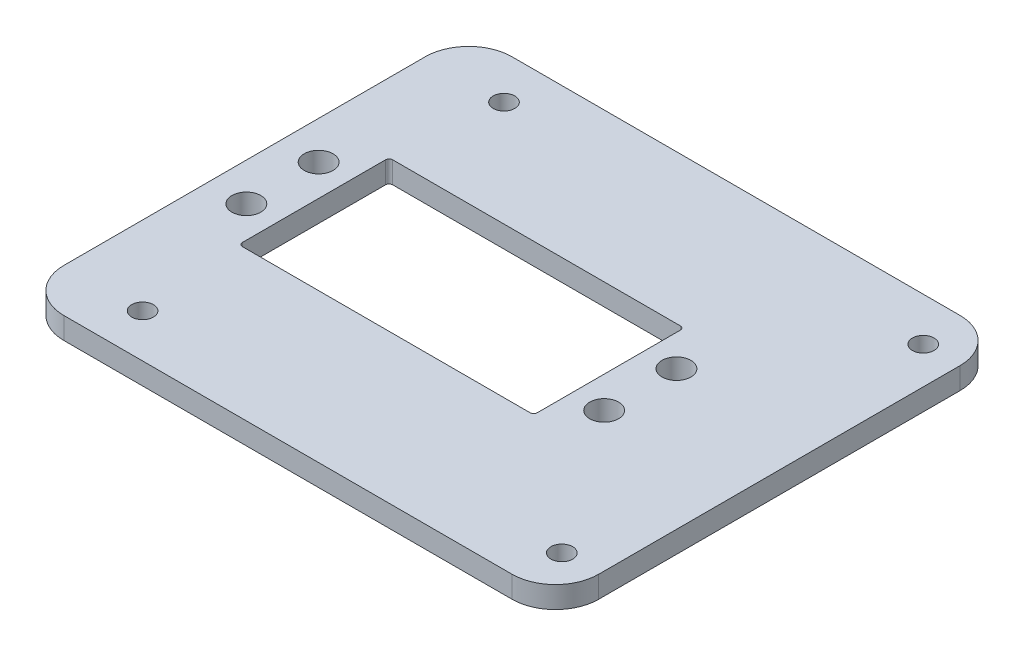
ISO-10303-21;
HEADER;
FILE_DESCRIPTION(('STEP AP214'),'2;1');
FILE_NAME('part.step','',(''),(''),'','','');
FILE_SCHEMA(('AUTOMOTIVE_DESIGN { 1 0 10303 214 1 1 1 1 }'));
ENDSEC;
DATA;
#1=APPLICATION_CONTEXT('core data for automotive mechanical design processes');
#2=APPLICATION_PROTOCOL_DEFINITION('international standard','automotive_design',2000,#1);
#3=PRODUCT_CONTEXT('',#1,'mechanical');
#4=PRODUCT('Part','Part','',(#3));
#5=PRODUCT_RELATED_PRODUCT_CATEGORY('part','',(#4));
#6=PRODUCT_DEFINITION_FORMATION('','',#4);
#7=PRODUCT_DEFINITION_CONTEXT('part definition',#1,'design');
#8=PRODUCT_DEFINITION('design','',#6,#7);
#9=PRODUCT_DEFINITION_SHAPE('','',#8);
#10=(LENGTH_UNIT() NAMED_UNIT(*) SI_UNIT(.MILLI.,.METRE.));
#11=(NAMED_UNIT(*) PLANE_ANGLE_UNIT() SI_UNIT($,.RADIAN.));
#12=(NAMED_UNIT(*) SI_UNIT($,.STERADIAN.) SOLID_ANGLE_UNIT());
#13=UNCERTAINTY_MEASURE_WITH_UNIT(LENGTH_MEASURE(1.E-05),#10,'distance_accuracy_value','');
#14=(GEOMETRIC_REPRESENTATION_CONTEXT(3) GLOBAL_UNCERTAINTY_ASSIGNED_CONTEXT((#13)) GLOBAL_UNIT_ASSIGNED_CONTEXT((#10,
#11,#12)) REPRESENTATION_CONTEXT('',''));
#15=CARTESIAN_POINT('',(0.,0.,0.));
#16=DIRECTION('',(0.,0.,1.));
#17=DIRECTION('',(1.,0.,0.));
#18=AXIS2_PLACEMENT_3D('',#15,#16,#17);
#19=CARTESIAN_POINT('',(20.4,3.,0.));
#20=DIRECTION('',(-1.,0.,0.));
#21=DIRECTION('',(0.,0.,1.));
#22=AXIS2_PLACEMENT_3D('',#19,#20,#21);
#23=PLANE('',#22);
#24=DIRECTION('',(0.,0.,-1.));
#25=VECTOR('',#24,1.);
#26=CARTESIAN_POINT('',(20.4,0.,0.));
#27=LINE('',#26,#25);
#28=CARTESIAN_POINT('',(20.4,0.,9.9));
#29=VERTEX_POINT('',#28);
#30=CARTESIAN_POINT('',(20.4,0.,-9.9));
#31=VERTEX_POINT('',#30);
#32=EDGE_CURVE('E183',#29,#31,#27,.T.);
#33=ORIENTED_EDGE('',*,*,#32,.F.);
#34=DIRECTION('',(0.,-1.,0.));
#35=VECTOR('',#34,1.);
#36=CARTESIAN_POINT('',(20.4,3.,9.9));
#37=LINE('',#36,#35);
#38=CARTESIAN_POINT('',(20.4,3.,9.9));
#39=VERTEX_POINT('',#38);
#40=EDGE_CURVE('E204',#29,#39,#37,.F.);
#41=ORIENTED_EDGE('',*,*,#40,.T.);
#42=DIRECTION('',(0.,0.,-1.));
#43=VECTOR('',#42,1.);
#44=CARTESIAN_POINT('',(20.4,3.,0.));
#45=LINE('',#44,#43);
#46=CARTESIAN_POINT('',(20.4,3.,-9.9));
#47=VERTEX_POINT('',#46);
#48=EDGE_CURVE('E360',#39,#47,#45,.T.);
#49=ORIENTED_EDGE('',*,*,#48,.T.);
#50=DIRECTION('',(0.,-1.,0.));
#51=VECTOR('',#50,1.);
#52=CARTESIAN_POINT('',(20.4,3.,-9.9));
#53=LINE('',#52,#51);
#54=EDGE_CURVE('E192',#47,#31,#53,.T.);
#55=ORIENTED_EDGE('',*,*,#54,.T.);
#56=EDGE_LOOP('',(#33,#41,#49,#55));
#57=FACE_BOUND('',#56,.T.);
#58=ADVANCED_FACE('F45',(#57),#23,.T.);
#59=CARTESIAN_POINT('',(0.,3.,10.4));
#60=DIRECTION('',(0.,0.,-1.));
#61=DIRECTION('',(-1.,0.,0.));
#62=AXIS2_PLACEMENT_3D('',#59,#60,#61);
#63=PLANE('',#62);
#64=DIRECTION('',(1.,0.,0.));
#65=VECTOR('',#64,1.);
#66=CARTESIAN_POINT('',(0.,3.,10.4));
#67=LINE('',#66,#65);
#68=CARTESIAN_POINT('',(-19.9,3.,10.4));
#69=VERTEX_POINT('',#68);
#70=CARTESIAN_POINT('',(19.9,3.,10.4));
#71=VERTEX_POINT('',#70);
#72=EDGE_CURVE('E364',#69,#71,#67,.T.);
#73=ORIENTED_EDGE('',*,*,#72,.T.);
#74=DIRECTION('',(0.,-1.,0.));
#75=VECTOR('',#74,1.);
#76=CARTESIAN_POINT('',(19.9,0.,10.4));
#77=LINE('',#76,#75);
#78=CARTESIAN_POINT('',(19.9,0.,10.4));
#79=VERTEX_POINT('',#78);
#80=EDGE_CURVE('E181',#71,#79,#77,.T.);
#81=ORIENTED_EDGE('',*,*,#80,.T.);
#82=DIRECTION('',(1.,0.,0.));
#83=VECTOR('',#82,1.);
#84=CARTESIAN_POINT('',(0.,0.,10.4));
#85=LINE('',#84,#83);
#86=CARTESIAN_POINT('',(-19.9,0.,10.4));
#87=VERTEX_POINT('',#86);
#88=EDGE_CURVE('E163',#87,#79,#85,.T.);
#89=ORIENTED_EDGE('',*,*,#88,.F.);
#90=DIRECTION('',(0.,-1.,0.));
#91=VECTOR('',#90,1.);
#92=CARTESIAN_POINT('',(-19.9,3.,10.4));
#93=LINE('',#92,#91);
#94=EDGE_CURVE('E178',#87,#69,#93,.F.);
#95=ORIENTED_EDGE('',*,*,#94,.T.);
#96=EDGE_LOOP('',(#73,#81,#89,#95));
#97=FACE_BOUND('',#96,.T.);
#98=ADVANCED_FACE('F177',(#97),#63,.T.);
#99=CARTESIAN_POINT('',(-20.4,3.,0.));
#100=DIRECTION('',(-1.,0.,0.));
#101=DIRECTION('',(0.,0.,1.));
#102=AXIS2_PLACEMENT_3D('',#99,#100,#101);
#103=PLANE('',#102);
#104=DIRECTION('',(0.,0.,-1.));
#105=VECTOR('',#104,1.);
#106=CARTESIAN_POINT('',(-20.4,3.,0.));
#107=LINE('',#106,#105);
#108=CARTESIAN_POINT('',(-20.4,3.,9.9));
#109=VERTEX_POINT('',#108);
#110=CARTESIAN_POINT('',(-20.4,3.,-9.9));
#111=VERTEX_POINT('',#110);
#112=EDGE_CURVE('E367',#109,#111,#107,.T.);
#113=ORIENTED_EDGE('',*,*,#112,.F.);
#114=DIRECTION('',(0.,-1.,0.));
#115=VECTOR('',#114,1.);
#116=CARTESIAN_POINT('',(-20.4,3.,9.9));
#117=LINE('',#116,#115);
#118=CARTESIAN_POINT('',(-20.4,0.,9.9));
#119=VERTEX_POINT('',#118);
#120=EDGE_CURVE('E210',#109,#119,#117,.T.);
#121=ORIENTED_EDGE('',*,*,#120,.T.);
#122=DIRECTION('',(0.,0.,-1.));
#123=VECTOR('',#122,1.);
#124=CARTESIAN_POINT('',(-20.4,0.,0.));
#125=LINE('',#124,#123);
#126=CARTESIAN_POINT('',(-20.4,0.,-9.9));
#127=VERTEX_POINT('',#126);
#128=EDGE_CURVE('E165',#119,#127,#125,.T.);
#129=ORIENTED_EDGE('',*,*,#128,.T.);
#130=DIRECTION('',(0.,-1.,0.));
#131=VECTOR('',#130,1.);
#132=CARTESIAN_POINT('',(-20.4,3.,-9.9));
#133=LINE('',#132,#131);
#134=EDGE_CURVE('E207',#127,#111,#133,.F.);
#135=ORIENTED_EDGE('',*,*,#134,.T.);
#136=EDGE_LOOP('',(#113,#121,#129,#135));
#137=FACE_BOUND('',#136,.T.);
#138=ADVANCED_FACE('F435',(#137),#103,.F.);
#139=CARTESIAN_POINT('',(0.,3.,31.));
#140=DIRECTION('',(0.,0.,-1.));
#141=DIRECTION('',(-1.,0.,0.));
#142=AXIS2_PLACEMENT_3D('',#139,#140,#141);
#143=PLANE('',#142);
#144=DIRECTION('',(1.,0.,0.));
#145=VECTOR('',#144,1.);
#146=CARTESIAN_POINT('',(0.,0.,31.));
#147=LINE('',#146,#145);
#148=CARTESIAN_POINT('',(-24.,0.,31.));
#149=VERTEX_POINT('',#148);
#150=CARTESIAN_POINT('',(38.,0.,31.));
#151=VERTEX_POINT('',#150);
#152=EDGE_CURVE('E402',#149,#151,#147,.T.);
#153=ORIENTED_EDGE('',*,*,#152,.T.);
#154=DIRECTION('',(0.,-1.,0.));
#155=VECTOR('',#154,1.);
#156=CARTESIAN_POINT('',(38.,3.,31.));
#157=LINE('',#156,#155);
#158=CARTESIAN_POINT('',(38.,3.,31.));
#159=VERTEX_POINT('',#158);
#160=EDGE_CURVE('E280',#151,#159,#157,.F.);
#161=ORIENTED_EDGE('',*,*,#160,.T.);
#162=DIRECTION('',(1.,0.,0.));
#163=VECTOR('',#162,1.);
#164=CARTESIAN_POINT('',(0.,3.,31.));
#165=LINE('',#164,#163);
#166=CARTESIAN_POINT('',(-24.,3.,31.));
#167=VERTEX_POINT('',#166);
#168=EDGE_CURVE('E344',#167,#159,#165,.T.);
#169=ORIENTED_EDGE('',*,*,#168,.F.);
#170=DIRECTION('',(0.,-1.,0.));
#171=VECTOR('',#170,1.);
#172=CARTESIAN_POINT('',(-24.,0.,31.));
#173=LINE('',#172,#171);
#174=EDGE_CURVE('E276',#167,#149,#173,.T.);
#175=ORIENTED_EDGE('',*,*,#174,.T.);
#176=EDGE_LOOP('',(#153,#161,#169,#175));
#177=FACE_BOUND('',#176,.T.);
#178=ADVANCED_FACE('F449',(#177),#143,.F.);
#179=CARTESIAN_POINT('',(44.,3.,0.));
#180=DIRECTION('',(1.,0.,0.));
#181=DIRECTION('',(0.,0.,-1.));
#182=AXIS2_PLACEMENT_3D('',#179,#180,#181);
#183=PLANE('',#182);
#184=DIRECTION('',(0.,0.,1.));
#185=VECTOR('',#184,1.);
#186=CARTESIAN_POINT('',(44.,0.,0.));
#187=LINE('',#186,#185);
#188=CARTESIAN_POINT('',(44.,0.,-25.));
#189=VERTEX_POINT('',#188);
#190=CARTESIAN_POINT('',(44.,0.,25.));
#191=VERTEX_POINT('',#190);
#192=EDGE_CURVE('E301',#189,#191,#187,.T.);
#193=ORIENTED_EDGE('',*,*,#192,.F.);
#194=DIRECTION('',(0.,-1.,0.));
#195=VECTOR('',#194,1.);
#196=CARTESIAN_POINT('',(44.,3.,-25.));
#197=LINE('',#196,#195);
#198=CARTESIAN_POINT('',(44.,3.,-25.));
#199=VERTEX_POINT('',#198);
#200=EDGE_CURVE('E262',#189,#199,#197,.F.);
#201=ORIENTED_EDGE('',*,*,#200,.T.);
#202=DIRECTION('',(0.,0.,1.));
#203=VECTOR('',#202,1.);
#204=CARTESIAN_POINT('',(44.,3.,0.));
#205=LINE('',#204,#203);
#206=CARTESIAN_POINT('',(44.,3.,25.));
#207=VERTEX_POINT('',#206);
#208=EDGE_CURVE('E350',#199,#207,#205,.T.);
#209=ORIENTED_EDGE('',*,*,#208,.T.);
#210=DIRECTION('',(0.,-1.,0.));
#211=VECTOR('',#210,1.);
#212=CARTESIAN_POINT('',(44.,0.,25.));
#213=LINE('',#212,#211);
#214=EDGE_CURVE('E258',#207,#191,#213,.T.);
#215=ORIENTED_EDGE('',*,*,#214,.T.);
#216=EDGE_LOOP('',(#193,#201,#209,#215));
#217=FACE_BOUND('',#216,.T.);
#218=ADVANCED_FACE('F410',(#217),#183,.T.);
#219=CARTESIAN_POINT('',(0.,3.,-31.));
#220=DIRECTION('',(0.,0.,-1.));
#221=DIRECTION('',(-1.,0.,0.));
#222=AXIS2_PLACEMENT_3D('',#219,#220,#221);
#223=PLANE('',#222);
#224=DIRECTION('',(1.,0.,0.));
#225=VECTOR('',#224,1.);
#226=CARTESIAN_POINT('',(0.,3.,-31.));
#227=LINE('',#226,#225);
#228=CARTESIAN_POINT('',(-24.,3.,-31.));
#229=VERTEX_POINT('',#228);
#230=CARTESIAN_POINT('',(38.,3.,-31.));
#231=VERTEX_POINT('',#230);
#232=EDGE_CURVE('E354',#229,#231,#227,.T.);
#233=ORIENTED_EDGE('',*,*,#232,.T.);
#234=DIRECTION('',(0.,-1.,0.));
#235=VECTOR('',#234,1.);
#236=CARTESIAN_POINT('',(38.,3.,-31.));
#237=LINE('',#236,#235);
#238=CARTESIAN_POINT('',(38.,0.,-31.));
#239=VERTEX_POINT('',#238);
#240=EDGE_CURVE('E242',#231,#239,#237,.T.);
#241=ORIENTED_EDGE('',*,*,#240,.T.);
#242=DIRECTION('',(1.,0.,0.));
#243=VECTOR('',#242,1.);
#244=CARTESIAN_POINT('',(0.,0.,-31.));
#245=LINE('',#244,#243);
#246=CARTESIAN_POINT('',(-24.,0.,-31.));
#247=VERTEX_POINT('',#246);
#248=EDGE_CURVE('E295',#247,#239,#245,.T.);
#249=ORIENTED_EDGE('',*,*,#248,.F.);
#250=DIRECTION('',(0.,-1.,0.));
#251=VECTOR('',#250,1.);
#252=CARTESIAN_POINT('',(-24.,3.,-31.));
#253=LINE('',#252,#251);
#254=EDGE_CURVE('E239',#247,#229,#253,.F.);
#255=ORIENTED_EDGE('',*,*,#254,.T.);
#256=EDGE_LOOP('',(#233,#241,#249,#255));
#257=FACE_BOUND('',#256,.T.);
#258=ADVANCED_FACE('F420',(#257),#223,.T.);
#259=CARTESIAN_POINT('',(38.89,3.,25.));
#260=DIRECTION('',(0.,-1.,0.));
#261=DIRECTION('',(0.,0.,-1.));
#262=AXIS2_PLACEMENT_3D('',#259,#260,#261);
#263=CYLINDRICAL_SURFACE('',#262,1.5);
#264=CARTESIAN_POINT('',(38.89,3.,25.));
#265=DIRECTION('',(0.,1.,0.));
#266=DIRECTION('',(0.,0.,1.));
#267=AXIS2_PLACEMENT_3D('',#264,#265,#266);
#268=CIRCLE('',#267,1.5);
#269=CARTESIAN_POINT('',(38.89,3.,26.5));
#270=VERTEX_POINT('',#269);
#271=EDGE_CURVE('E195',#270,#270,#268,.T.);
#272=ORIENTED_EDGE('',*,*,#271,.T.);
#273=EDGE_LOOP('',(#272));
#274=FACE_BOUND('',#273,.T.);
#275=CARTESIAN_POINT('',(38.89,0.,25.));
#276=DIRECTION('',(0.,1.,0.));
#277=DIRECTION('',(0.,0.,1.));
#278=AXIS2_PLACEMENT_3D('',#275,#276,#277);
#279=CIRCLE('',#278,1.5);
#280=CARTESIAN_POINT('',(38.89,0.,26.5));
#281=VERTEX_POINT('',#280);
#282=EDGE_CURVE('E326',#281,#281,#279,.T.);
#283=ORIENTED_EDGE('',*,*,#282,.F.);
#284=EDGE_LOOP('',(#283));
#285=FACE_BOUND('',#284,.T.);
#286=ADVANCED_FACE('F446',(#274,#285),#263,.F.);
#287=CARTESIAN_POINT('',(-19.11,3.,25.));
#288=DIRECTION('',(0.,-1.,0.));
#289=DIRECTION('',(0.,0.,-1.));
#290=AXIS2_PLACEMENT_3D('',#287,#288,#289);
#291=CYLINDRICAL_SURFACE('',#290,1.5);
#292=CARTESIAN_POINT('',(-19.11,3.,25.));
#293=DIRECTION('',(0.,1.,0.));
#294=DIRECTION('',(0.,0.,1.));
#295=AXIS2_PLACEMENT_3D('',#292,#293,#294);
#296=CIRCLE('',#295,1.5);
#297=CARTESIAN_POINT('',(-19.11,3.,26.5));
#298=VERTEX_POINT('',#297);
#299=EDGE_CURVE('E387',#298,#298,#296,.F.);
#300=ORIENTED_EDGE('',*,*,#299,.F.);
#301=EDGE_LOOP('',(#300));
#302=FACE_BOUND('',#301,.T.);
#303=CARTESIAN_POINT('',(-19.11,0.,25.));
#304=DIRECTION('',(0.,1.,0.));
#305=DIRECTION('',(0.,0.,1.));
#306=AXIS2_PLACEMENT_3D('',#303,#304,#305);
#307=CIRCLE('',#306,1.5);
#308=CARTESIAN_POINT('',(-19.11,0.,26.5));
#309=VERTEX_POINT('',#308);
#310=EDGE_CURVE('E323',#309,#309,#307,.F.);
#311=ORIENTED_EDGE('',*,*,#310,.T.);
#312=EDGE_LOOP('',(#311));
#313=FACE_BOUND('',#312,.T.);
#314=ADVANCED_FACE('F616',(#302,#313),#291,.F.);
#315=CARTESIAN_POINT('',(-19.11,3.,-25.));
#316=DIRECTION('',(0.,-1.,0.));
#317=DIRECTION('',(0.,0.,-1.));
#318=AXIS2_PLACEMENT_3D('',#315,#316,#317);
#319=CYLINDRICAL_SURFACE('',#318,1.5);
#320=CARTESIAN_POINT('',(-19.11,3.,-25.));
#321=DIRECTION('',(0.,1.,0.));
#322=DIRECTION('',(0.,0.,1.));
#323=AXIS2_PLACEMENT_3D('',#320,#321,#322);
#324=CIRCLE('',#323,1.5);
#325=CARTESIAN_POINT('',(-19.11,3.,-23.5));
#326=VERTEX_POINT('',#325);
#327=EDGE_CURVE('E383',#326,#326,#324,.T.);
#328=ORIENTED_EDGE('',*,*,#327,.T.);
#329=EDGE_LOOP('',(#328));
#330=FACE_BOUND('',#329,.T.);
#331=CARTESIAN_POINT('',(-19.11,0.,-25.));
#332=DIRECTION('',(0.,1.,0.));
#333=DIRECTION('',(0.,0.,1.));
#334=AXIS2_PLACEMENT_3D('',#331,#332,#333);
#335=CIRCLE('',#334,1.5);
#336=CARTESIAN_POINT('',(-19.11,0.,-23.5));
#337=VERTEX_POINT('',#336);
#338=EDGE_CURVE('E319',#337,#337,#335,.T.);
#339=ORIENTED_EDGE('',*,*,#338,.F.);
#340=EDGE_LOOP('',(#339));
#341=FACE_BOUND('',#340,.T.);
#342=ADVANCED_FACE('F606',(#330,#341),#319,.F.);
#343=CARTESIAN_POINT('',(24.75,3.,4.99999999999999));
#344=DIRECTION('',(0.,-1.,0.));
#345=DIRECTION('',(0.,0.,-1.));
#346=AXIS2_PLACEMENT_3D('',#343,#344,#345);
#347=CYLINDRICAL_SURFACE('',#346,2.);
#348=CARTESIAN_POINT('',(24.75,3.,4.99999999999999));
#349=DIRECTION('',(0.,1.,0.));
#350=DIRECTION('',(0.,0.,1.));
#351=AXIS2_PLACEMENT_3D('',#348,#349,#350);
#352=CIRCLE('',#351,2.);
#353=CARTESIAN_POINT('',(24.75,3.,7.));
#354=VERTEX_POINT('',#353);
#355=EDGE_CURVE('E379',#354,#354,#352,.F.);
#356=ORIENTED_EDGE('',*,*,#355,.F.);
#357=EDGE_LOOP('',(#356));
#358=FACE_BOUND('',#357,.T.);
#359=CARTESIAN_POINT('',(24.75,0.,4.99999999999999));
#360=DIRECTION('',(0.,1.,0.));
#361=DIRECTION('',(0.,0.,1.));
#362=AXIS2_PLACEMENT_3D('',#359,#360,#361);
#363=CIRCLE('',#362,2.);
#364=CARTESIAN_POINT('',(24.75,0.,7.));
#365=VERTEX_POINT('',#364);
#366=EDGE_CURVE('E315',#365,#365,#363,.F.);
#367=ORIENTED_EDGE('',*,*,#366,.T.);
#368=EDGE_LOOP('',(#367));
#369=FACE_BOUND('',#368,.T.);
#370=ADVANCED_FACE('F596',(#358,#369),#347,.F.);
#371=CARTESIAN_POINT('',(24.75,3.,-5.00000000000001));
#372=DIRECTION('',(0.,-1.,0.));
#373=DIRECTION('',(0.,0.,-1.));
#374=AXIS2_PLACEMENT_3D('',#371,#372,#373);
#375=CYLINDRICAL_SURFACE('',#374,2.);
#376=CARTESIAN_POINT('',(24.75,3.,-5.00000000000001));
#377=DIRECTION('',(0.,1.,0.));
#378=DIRECTION('',(0.,0.,1.));
#379=AXIS2_PLACEMENT_3D('',#376,#377,#378);
#380=CIRCLE('',#379,2.);
#381=CARTESIAN_POINT('',(24.75,3.,-3.));
#382=VERTEX_POINT('',#381);
#383=EDGE_CURVE('E375',#382,#382,#380,.T.);
#384=ORIENTED_EDGE('',*,*,#383,.T.);
#385=EDGE_LOOP('',(#384));
#386=FACE_BOUND('',#385,.T.);
#387=CARTESIAN_POINT('',(24.75,0.,-5.00000000000001));
#388=DIRECTION('',(0.,1.,0.));
#389=DIRECTION('',(0.,0.,1.));
#390=AXIS2_PLACEMENT_3D('',#387,#388,#389);
#391=CIRCLE('',#390,2.);
#392=CARTESIAN_POINT('',(24.75,0.,-3.));
#393=VERTEX_POINT('',#392);
#394=EDGE_CURVE('E311',#393,#393,#391,.T.);
#395=ORIENTED_EDGE('',*,*,#394,.F.);
#396=EDGE_LOOP('',(#395));
#397=FACE_BOUND('',#396,.T.);
#398=ADVANCED_FACE('F586',(#386,#397),#375,.F.);
#399=CARTESIAN_POINT('',(0.,3.,-10.4));
#400=DIRECTION('',(0.,0.,-1.));
#401=DIRECTION('',(-1.,0.,0.));
#402=AXIS2_PLACEMENT_3D('',#399,#400,#401);
#403=PLANE('',#402);
#404=DIRECTION('',(1.,0.,0.));
#405=VECTOR('',#404,1.);
#406=CARTESIAN_POINT('',(0.,0.,-10.4));
#407=LINE('',#406,#405);
#408=CARTESIAN_POINT('',(-19.9,0.,-10.4));
#409=VERTEX_POINT('',#408);
#410=CARTESIAN_POINT('',(19.9,0.,-10.4));
#411=VERTEX_POINT('',#410);
#412=EDGE_CURVE('E307',#409,#411,#407,.T.);
#413=ORIENTED_EDGE('',*,*,#412,.T.);
#414=DIRECTION('',(0.,-1.,0.));
#415=VECTOR('',#414,1.);
#416=CARTESIAN_POINT('',(19.9,3.,-10.4));
#417=LINE('',#416,#415);
#418=CARTESIAN_POINT('',(19.9,3.,-10.4));
#419=VERTEX_POINT('',#418);
#420=EDGE_CURVE('E217',#411,#419,#417,.F.);
#421=ORIENTED_EDGE('',*,*,#420,.T.);
#422=DIRECTION('',(1.,0.,0.));
#423=VECTOR('',#422,1.);
#424=CARTESIAN_POINT('',(0.,3.,-10.4));
#425=LINE('',#424,#423);
#426=CARTESIAN_POINT('',(-19.9,3.,-10.4));
#427=VERTEX_POINT('',#426);
#428=EDGE_CURVE('E371',#427,#419,#425,.T.);
#429=ORIENTED_EDGE('',*,*,#428,.F.);
#430=DIRECTION('',(0.,-1.,0.));
#431=VECTOR('',#430,1.);
#432=CARTESIAN_POINT('',(-19.9,0.,-10.4));
#433=LINE('',#432,#431);
#434=EDGE_CURVE('E213',#427,#409,#433,.T.);
#435=ORIENTED_EDGE('',*,*,#434,.T.);
#436=EDGE_LOOP('',(#413,#421,#429,#435));
#437=FACE_BOUND('',#436,.T.);
#438=ADVANCED_FACE('F443',(#437),#403,.F.);
#439=CARTESIAN_POINT('',(-30.,3.,0.));
#440=DIRECTION('',(-1.,0.,0.));
#441=DIRECTION('',(0.,0.,1.));
#442=AXIS2_PLACEMENT_3D('',#439,#440,#441);
#443=PLANE('',#442);
#444=DIRECTION('',(0.,0.,-1.));
#445=VECTOR('',#444,1.);
#446=CARTESIAN_POINT('',(-30.,0.,0.));
#447=LINE('',#446,#445);
#448=CARTESIAN_POINT('',(-30.,0.,25.));
#449=VERTEX_POINT('',#448);
#450=CARTESIAN_POINT('',(-30.,0.,-25.));
#451=VERTEX_POINT('',#450);
#452=EDGE_CURVE('E287',#449,#451,#447,.T.);
#453=ORIENTED_EDGE('',*,*,#452,.F.);
#454=DIRECTION('',(0.,-1.,0.));
#455=VECTOR('',#454,1.);
#456=CARTESIAN_POINT('',(-30.,3.,25.));
#457=LINE('',#456,#455);
#458=CARTESIAN_POINT('',(-30.,3.,25.));
#459=VERTEX_POINT('',#458);
#460=EDGE_CURVE('E11',#449,#459,#457,.F.);
#461=ORIENTED_EDGE('',*,*,#460,.T.);
#462=DIRECTION('',(0.,0.,-1.));
#463=VECTOR('',#462,1.);
#464=CARTESIAN_POINT('',(-30.,3.,0.));
#465=LINE('',#464,#463);
#466=CARTESIAN_POINT('',(-30.,3.,-25.));
#467=VERTEX_POINT('',#466);
#468=EDGE_CURVE('E288',#459,#467,#465,.T.);
#469=ORIENTED_EDGE('',*,*,#468,.T.);
#470=DIRECTION('',(0.,-1.,0.));
#471=VECTOR('',#470,1.);
#472=CARTESIAN_POINT('',(-30.,3.,-25.));
#473=LINE('',#472,#471);
#474=EDGE_CURVE('E54',#467,#451,#473,.T.);
#475=ORIENTED_EDGE('',*,*,#474,.T.);
#476=EDGE_LOOP('',(#453,#461,#469,#475));
#477=FACE_BOUND('',#476,.T.);
#478=ADVANCED_FACE('F286',(#477),#443,.T.);
#479=CARTESIAN_POINT('',(-24.75,3.,4.99999999999999));
#480=DIRECTION('',(0.,-1.,0.));
#481=DIRECTION('',(0.,0.,-1.));
#482=AXIS2_PLACEMENT_3D('',#479,#480,#481);
#483=CYLINDRICAL_SURFACE('',#482,2.);
#484=CARTESIAN_POINT('',(-24.75,3.,4.99999999999999));
#485=DIRECTION('',(0.,1.,0.));
#486=DIRECTION('',(0.,0.,1.));
#487=AXIS2_PLACEMENT_3D('',#484,#485,#486);
#488=CIRCLE('',#487,2.);
#489=CARTESIAN_POINT('',(-24.75,3.,7.));
#490=VERTEX_POINT('',#489);
#491=EDGE_CURVE('E338',#490,#490,#488,.T.);
#492=ORIENTED_EDGE('',*,*,#491,.T.);
#493=EDGE_LOOP('',(#492));
#494=FACE_BOUND('',#493,.T.);
#495=CARTESIAN_POINT('',(-24.75,0.,4.99999999999999));
#496=DIRECTION('',(0.,1.,0.));
#497=DIRECTION('',(0.,0.,1.));
#498=AXIS2_PLACEMENT_3D('',#495,#496,#497);
#499=CIRCLE('',#498,2.);
#500=CARTESIAN_POINT('',(-24.75,0.,7.));
#501=VERTEX_POINT('',#500);
#502=EDGE_CURVE('E398',#501,#501,#499,.T.);
#503=ORIENTED_EDGE('',*,*,#502,.F.);
#504=EDGE_LOOP('',(#503));
#505=FACE_BOUND('',#504,.T.);
#506=ADVANCED_FACE('F442',(#494,#505),#483,.F.);
#507=CARTESIAN_POINT('',(-24.75,3.,-5.00000000000001));
#508=DIRECTION('',(0.,-1.,0.));
#509=DIRECTION('',(0.,0.,-1.));
#510=AXIS2_PLACEMENT_3D('',#507,#508,#509);
#511=CYLINDRICAL_SURFACE('',#510,2.);
#512=CARTESIAN_POINT('',(-24.75,3.,-5.00000000000001));
#513=DIRECTION('',(0.,1.,0.));
#514=DIRECTION('',(0.,0.,1.));
#515=AXIS2_PLACEMENT_3D('',#512,#513,#514);
#516=CIRCLE('',#515,2.);
#517=CARTESIAN_POINT('',(-24.75,3.,-3.));
#518=VERTEX_POINT('',#517);
#519=EDGE_CURVE('E333',#518,#518,#516,.F.);
#520=ORIENTED_EDGE('',*,*,#519,.F.);
#521=EDGE_LOOP('',(#520));
#522=FACE_BOUND('',#521,.T.);
#523=CARTESIAN_POINT('',(-24.75,0.,-5.00000000000001));
#524=DIRECTION('',(0.,1.,0.));
#525=DIRECTION('',(0.,0.,1.));
#526=AXIS2_PLACEMENT_3D('',#523,#524,#525);
#527=CIRCLE('',#526,2.);
#528=CARTESIAN_POINT('',(-24.75,0.,-3.));
#529=VERTEX_POINT('',#528);
#530=EDGE_CURVE('E394',#529,#529,#527,.F.);
#531=ORIENTED_EDGE('',*,*,#530,.T.);
#532=EDGE_LOOP('',(#531));
#533=FACE_BOUND('',#532,.T.);
#534=ADVANCED_FACE('F455',(#522,#533),#511,.F.);
#535=CARTESIAN_POINT('',(38.89,3.,-25.));
#536=DIRECTION('',(0.,-1.,0.));
#537=DIRECTION('',(0.,0.,-1.));
#538=AXIS2_PLACEMENT_3D('',#535,#536,#537);
#539=CYLINDRICAL_SURFACE('',#538,1.5);
#540=CARTESIAN_POINT('',(38.89,3.,-25.));
#541=DIRECTION('',(0.,1.,0.));
#542=DIRECTION('',(0.,0.,1.));
#543=AXIS2_PLACEMENT_3D('',#540,#541,#542);
#544=CIRCLE('',#543,1.5);
#545=CARTESIAN_POINT('',(38.89,3.,-23.5));
#546=VERTEX_POINT('',#545);
#547=EDGE_CURVE('E188',#546,#546,#544,.F.);
#548=ORIENTED_EDGE('',*,*,#547,.F.);
#549=EDGE_LOOP('',(#548));
#550=FACE_BOUND('',#549,.T.);
#551=CARTESIAN_POINT('',(38.89,0.,-25.));
#552=DIRECTION('',(0.,1.,0.));
#553=DIRECTION('',(0.,0.,1.));
#554=AXIS2_PLACEMENT_3D('',#551,#552,#553);
#555=CIRCLE('',#554,1.5);
#556=CARTESIAN_POINT('',(38.89,0.,-23.5));
#557=VERTEX_POINT('',#556);
#558=EDGE_CURVE('E198',#557,#557,#555,.F.);
#559=ORIENTED_EDGE('',*,*,#558,.T.);
#560=EDGE_LOOP('',(#559));
#561=FACE_BOUND('',#560,.T.);
#562=ADVANCED_FACE('F459',(#550,#561),#539,.F.);
#563=CARTESIAN_POINT('',(0.,3.,0.));
#564=DIRECTION('',(0.,1.,0.));
#565=DIRECTION('',(0.,0.,1.));
#566=AXIS2_PLACEMENT_3D('',#563,#564,#565);
#567=PLANE('',#566);
#568=ORIENTED_EDGE('',*,*,#519,.T.);
#569=EDGE_LOOP('',(#568));
#570=FACE_BOUND('',#569,.T.);
#571=ORIENTED_EDGE('',*,*,#491,.F.);
#572=EDGE_LOOP('',(#571));
#573=FACE_BOUND('',#572,.T.);
#574=ORIENTED_EDGE('',*,*,#208,.F.);
#575=CARTESIAN_POINT('',(38.,3.,-25.));
#576=DIRECTION('',(0.,1.,0.));
#577=DIRECTION('',(0.,0.,1.));
#578=AXIS2_PLACEMENT_3D('',#575,#576,#577);
#579=CIRCLE('',#578,6.);
#580=EDGE_CURVE('E273',#199,#231,#579,.T.);
#581=ORIENTED_EDGE('',*,*,#580,.T.);
#582=ORIENTED_EDGE('',*,*,#232,.F.);
#583=CARTESIAN_POINT('',(-24.,3.,-25.));
#584=DIRECTION('',(0.,1.,0.));
#585=DIRECTION('',(0.,0.,1.));
#586=AXIS2_PLACEMENT_3D('',#583,#584,#585);
#587=CIRCLE('',#586,6.);
#588=EDGE_CURVE('E61',#229,#467,#587,.T.);
#589=ORIENTED_EDGE('',*,*,#588,.T.);
#590=ORIENTED_EDGE('',*,*,#468,.F.);
#591=CARTESIAN_POINT('',(-24.,3.,25.));
#592=DIRECTION('',(0.,1.,0.));
#593=DIRECTION('',(0.,0.,1.));
#594=AXIS2_PLACEMENT_3D('',#591,#592,#593);
#595=CIRCLE('',#594,6.);
#596=EDGE_CURVE('E267',#459,#167,#595,.T.);
#597=ORIENTED_EDGE('',*,*,#596,.T.);
#598=ORIENTED_EDGE('',*,*,#168,.T.);
#599=CARTESIAN_POINT('',(38.,3.,25.));
#600=DIRECTION('',(0.,1.,0.));
#601=DIRECTION('',(0.,0.,1.));
#602=AXIS2_PLACEMENT_3D('',#599,#600,#601);
#603=CIRCLE('',#602,6.);
#604=EDGE_CURVE('E270',#159,#207,#603,.T.);
#605=ORIENTED_EDGE('',*,*,#604,.T.);
#606=EDGE_LOOP('',(#574,#581,#582,#589,#590,#597,#598,#605));
#607=FACE_BOUND('',#606,.T.);
#608=ORIENTED_EDGE('',*,*,#48,.F.);
#609=CARTESIAN_POINT('',(19.9,3.,9.9));
#610=DIRECTION('',(0.,1.,0.));
#611=DIRECTION('',(0.,0.,1.));
#612=AXIS2_PLACEMENT_3D('',#609,#610,#611);
#613=CIRCLE('',#612,0.5);
#614=EDGE_CURVE('E172',#39,#71,#613,.F.);
#615=ORIENTED_EDGE('',*,*,#614,.T.);
#616=ORIENTED_EDGE('',*,*,#72,.F.);
#617=CARTESIAN_POINT('',(-19.9,3.,9.9));
#618=DIRECTION('',(0.,1.,0.));
#619=DIRECTION('',(0.,0.,1.));
#620=AXIS2_PLACEMENT_3D('',#617,#618,#619);
#621=CIRCLE('',#620,0.5);
#622=EDGE_CURVE('E171',#69,#109,#621,.F.);
#623=ORIENTED_EDGE('',*,*,#622,.T.);
#624=ORIENTED_EDGE('',*,*,#112,.T.);
#625=CARTESIAN_POINT('',(-19.9,3.,-9.9));
#626=DIRECTION('',(0.,1.,0.));
#627=DIRECTION('',(0.,0.,1.));
#628=AXIS2_PLACEMENT_3D('',#625,#626,#627);
#629=CIRCLE('',#628,0.5);
#630=EDGE_CURVE('E236',#111,#427,#629,.F.);
#631=ORIENTED_EDGE('',*,*,#630,.T.);
#632=ORIENTED_EDGE('',*,*,#428,.T.);
#633=CARTESIAN_POINT('',(19.9,3.,-9.9));
#634=DIRECTION('',(0.,1.,0.));
#635=DIRECTION('',(0.,0.,1.));
#636=AXIS2_PLACEMENT_3D('',#633,#634,#635);
#637=CIRCLE('',#636,0.5);
#638=EDGE_CURVE('E230',#419,#47,#637,.F.);
#639=ORIENTED_EDGE('',*,*,#638,.T.);
#640=EDGE_LOOP('',(#608,#615,#616,#623,#624,#631,#632,#639));
#641=FACE_BOUND('',#640,.T.);
#642=ORIENTED_EDGE('',*,*,#383,.F.);
#643=EDGE_LOOP('',(#642));
#644=FACE_BOUND('',#643,.T.);
#645=ORIENTED_EDGE('',*,*,#355,.T.);
#646=EDGE_LOOP('',(#645));
#647=FACE_BOUND('',#646,.T.);
#648=ORIENTED_EDGE('',*,*,#327,.F.);
#649=EDGE_LOOP('',(#648));
#650=FACE_BOUND('',#649,.T.);
#651=ORIENTED_EDGE('',*,*,#299,.T.);
#652=EDGE_LOOP('',(#651));
#653=FACE_BOUND('',#652,.T.);
#654=ORIENTED_EDGE('',*,*,#271,.F.);
#655=EDGE_LOOP('',(#654));
#656=FACE_BOUND('',#655,.T.);
#657=ORIENTED_EDGE('',*,*,#547,.T.);
#658=EDGE_LOOP('',(#657));
#659=FACE_BOUND('',#658,.T.);
#660=ADVANCED_FACE('F417',(#570,#573,#607,#641,#644,#647,#650,#653,#656,#659),#567,.T.);
#661=CARTESIAN_POINT('',(0.,0.,0.));
#662=DIRECTION('',(0.,1.,0.));
#663=DIRECTION('',(0.,0.,1.));
#664=AXIS2_PLACEMENT_3D('',#661,#662,#663);
#665=PLANE('',#664);
#666=ORIENTED_EDGE('',*,*,#530,.F.);
#667=EDGE_LOOP('',(#666));
#668=FACE_BOUND('',#667,.T.);
#669=ORIENTED_EDGE('',*,*,#502,.T.);
#670=EDGE_LOOP('',(#669));
#671=FACE_BOUND('',#670,.T.);
#672=ORIENTED_EDGE('',*,*,#248,.T.);
#673=CARTESIAN_POINT('',(38.,0.,-25.));
#674=DIRECTION('',(0.,1.,0.));
#675=DIRECTION('',(0.,0.,1.));
#676=AXIS2_PLACEMENT_3D('',#673,#674,#675);
#677=CIRCLE('',#676,6.);
#678=EDGE_CURVE('E255',#239,#189,#677,.F.);
#679=ORIENTED_EDGE('',*,*,#678,.T.);
#680=ORIENTED_EDGE('',*,*,#192,.T.);
#681=CARTESIAN_POINT('',(38.,0.,25.));
#682=DIRECTION('',(0.,1.,0.));
#683=DIRECTION('',(0.,0.,1.));
#684=AXIS2_PLACEMENT_3D('',#681,#682,#683);
#685=CIRCLE('',#684,6.);
#686=EDGE_CURVE('E252',#191,#151,#685,.F.);
#687=ORIENTED_EDGE('',*,*,#686,.T.);
#688=ORIENTED_EDGE('',*,*,#152,.F.);
#689=CARTESIAN_POINT('',(-24.,0.,25.));
#690=DIRECTION('',(0.,1.,0.));
#691=DIRECTION('',(0.,0.,1.));
#692=AXIS2_PLACEMENT_3D('',#689,#690,#691);
#693=CIRCLE('',#692,6.);
#694=EDGE_CURVE('E249',#149,#449,#693,.F.);
#695=ORIENTED_EDGE('',*,*,#694,.T.);
#696=ORIENTED_EDGE('',*,*,#452,.T.);
#697=CARTESIAN_POINT('',(-24.,0.,-25.));
#698=DIRECTION('',(0.,1.,0.));
#699=DIRECTION('',(0.,0.,1.));
#700=AXIS2_PLACEMENT_3D('',#697,#698,#699);
#701=CIRCLE('',#700,6.);
#702=EDGE_CURVE('E246',#451,#247,#701,.F.);
#703=ORIENTED_EDGE('',*,*,#702,.T.);
#704=EDGE_LOOP('',(#672,#679,#680,#687,#688,#695,#696,#703));
#705=FACE_BOUND('',#704,.T.);
#706=ORIENTED_EDGE('',*,*,#88,.T.);
#707=CARTESIAN_POINT('',(19.9,0.,9.9));
#708=DIRECTION('',(0.,1.,0.));
#709=DIRECTION('',(0.,0.,1.));
#710=AXIS2_PLACEMENT_3D('',#707,#708,#709);
#711=CIRCLE('',#710,0.5);
#712=EDGE_CURVE('E220',#79,#29,#711,.T.);
#713=ORIENTED_EDGE('',*,*,#712,.T.);
#714=ORIENTED_EDGE('',*,*,#32,.T.);
#715=CARTESIAN_POINT('',(19.9,0.,-9.9));
#716=DIRECTION('',(0.,1.,0.));
#717=DIRECTION('',(0.,0.,1.));
#718=AXIS2_PLACEMENT_3D('',#715,#716,#717);
#719=CIRCLE('',#718,0.5);
#720=EDGE_CURVE('E227',#31,#411,#719,.T.);
#721=ORIENTED_EDGE('',*,*,#720,.T.);
#722=ORIENTED_EDGE('',*,*,#412,.F.);
#723=CARTESIAN_POINT('',(-19.9,0.,-9.9));
#724=DIRECTION('',(0.,1.,0.));
#725=DIRECTION('',(0.,0.,1.));
#726=AXIS2_PLACEMENT_3D('',#723,#724,#725);
#727=CIRCLE('',#726,0.5);
#728=EDGE_CURVE('E233',#409,#127,#727,.T.);
#729=ORIENTED_EDGE('',*,*,#728,.T.);
#730=ORIENTED_EDGE('',*,*,#128,.F.);
#731=CARTESIAN_POINT('',(-19.9,0.,9.9));
#732=DIRECTION('',(0.,1.,0.));
#733=DIRECTION('',(0.,0.,1.));
#734=AXIS2_PLACEMENT_3D('',#731,#732,#733);
#735=CIRCLE('',#734,0.5);
#736=EDGE_CURVE('E159',#119,#87,#735,.T.);
#737=ORIENTED_EDGE('',*,*,#736,.T.);
#738=EDGE_LOOP('',(#706,#713,#714,#721,#722,#729,#730,#737));
#739=FACE_BOUND('',#738,.T.);
#740=ORIENTED_EDGE('',*,*,#394,.T.);
#741=EDGE_LOOP('',(#740));
#742=FACE_BOUND('',#741,.T.);
#743=ORIENTED_EDGE('',*,*,#366,.F.);
#744=EDGE_LOOP('',(#743));
#745=FACE_BOUND('',#744,.T.);
#746=ORIENTED_EDGE('',*,*,#338,.T.);
#747=EDGE_LOOP('',(#746));
#748=FACE_BOUND('',#747,.T.);
#749=ORIENTED_EDGE('',*,*,#310,.F.);
#750=EDGE_LOOP('',(#749));
#751=FACE_BOUND('',#750,.T.);
#752=ORIENTED_EDGE('',*,*,#282,.T.);
#753=EDGE_LOOP('',(#752));
#754=FACE_BOUND('',#753,.T.);
#755=ORIENTED_EDGE('',*,*,#558,.F.);
#756=EDGE_LOOP('',(#755));
#757=FACE_BOUND('',#756,.T.);
#758=ADVANCED_FACE('F161',(#668,#671,#705,#739,#742,#745,#748,#751,#754,#757),#665,.F.);
#759=CARTESIAN_POINT('',(19.9,3.,9.9));
#760=DIRECTION('',(0.,1.,0.));
#761=DIRECTION('',(0.,0.,1.));
#762=AXIS2_PLACEMENT_3D('',#759,#760,#761);
#763=CYLINDRICAL_SURFACE('',#762,0.5);
#764=ORIENTED_EDGE('',*,*,#614,.F.);
#765=ORIENTED_EDGE('',*,*,#40,.F.);
#766=ORIENTED_EDGE('',*,*,#712,.F.);
#767=ORIENTED_EDGE('',*,*,#80,.F.);
#768=EDGE_LOOP('',(#764,#765,#766,#767));
#769=FACE_BOUND('',#768,.T.);
#770=ADVANCED_FACE('F461',(#769),#763,.F.);
#771=CARTESIAN_POINT('',(-19.9,3.,9.9));
#772=DIRECTION('',(0.,-1.,0.));
#773=DIRECTION('',(0.,0.,-1.));
#774=AXIS2_PLACEMENT_3D('',#771,#772,#773);
#775=CYLINDRICAL_SURFACE('',#774,0.5);
#776=ORIENTED_EDGE('',*,*,#622,.F.);
#777=ORIENTED_EDGE('',*,*,#94,.F.);
#778=ORIENTED_EDGE('',*,*,#736,.F.);
#779=ORIENTED_EDGE('',*,*,#120,.F.);
#780=EDGE_LOOP('',(#776,#777,#778,#779));
#781=FACE_BOUND('',#780,.T.);
#782=ADVANCED_FACE('F186',(#781),#775,.F.);
#783=CARTESIAN_POINT('',(19.9,3.,-9.9));
#784=DIRECTION('',(0.,-1.,0.));
#785=DIRECTION('',(0.,0.,-1.));
#786=AXIS2_PLACEMENT_3D('',#783,#784,#785);
#787=CYLINDRICAL_SURFACE('',#786,0.5);
#788=ORIENTED_EDGE('',*,*,#638,.F.);
#789=ORIENTED_EDGE('',*,*,#420,.F.);
#790=ORIENTED_EDGE('',*,*,#720,.F.);
#791=ORIENTED_EDGE('',*,*,#54,.F.);
#792=EDGE_LOOP('',(#788,#789,#790,#791));
#793=FACE_BOUND('',#792,.T.);
#794=ADVANCED_FACE('F467',(#793),#787,.F.);
#795=CARTESIAN_POINT('',(-19.9,3.,-9.9));
#796=DIRECTION('',(0.,1.,0.));
#797=DIRECTION('',(0.,0.,1.));
#798=AXIS2_PLACEMENT_3D('',#795,#796,#797);
#799=CYLINDRICAL_SURFACE('',#798,0.5);
#800=ORIENTED_EDGE('',*,*,#630,.F.);
#801=ORIENTED_EDGE('',*,*,#134,.F.);
#802=ORIENTED_EDGE('',*,*,#728,.F.);
#803=ORIENTED_EDGE('',*,*,#434,.F.);
#804=EDGE_LOOP('',(#800,#801,#802,#803));
#805=FACE_BOUND('',#804,.T.);
#806=ADVANCED_FACE('F470',(#805),#799,.F.);
#807=CARTESIAN_POINT('',(38.,3.,-25.));
#808=DIRECTION('',(0.,-1.,0.));
#809=DIRECTION('',(0.,0.,-1.));
#810=AXIS2_PLACEMENT_3D('',#807,#808,#809);
#811=CYLINDRICAL_SURFACE('',#810,6.);
#812=ORIENTED_EDGE('',*,*,#580,.F.);
#813=ORIENTED_EDGE('',*,*,#200,.F.);
#814=ORIENTED_EDGE('',*,*,#678,.F.);
#815=ORIENTED_EDGE('',*,*,#240,.F.);
#816=EDGE_LOOP('',(#812,#813,#814,#815));
#817=FACE_BOUND('',#816,.T.);
#818=ADVANCED_FACE('F415',(#817),#811,.T.);
#819=CARTESIAN_POINT('',(38.,3.,25.));
#820=DIRECTION('',(0.,1.,0.));
#821=DIRECTION('',(0.,0.,1.));
#822=AXIS2_PLACEMENT_3D('',#819,#820,#821);
#823=CYLINDRICAL_SURFACE('',#822,6.);
#824=ORIENTED_EDGE('',*,*,#604,.F.);
#825=ORIENTED_EDGE('',*,*,#160,.F.);
#826=ORIENTED_EDGE('',*,*,#686,.F.);
#827=ORIENTED_EDGE('',*,*,#214,.F.);
#828=EDGE_LOOP('',(#824,#825,#826,#827));
#829=FACE_BOUND('',#828,.T.);
#830=ADVANCED_FACE('F427',(#829),#823,.T.);
#831=CARTESIAN_POINT('',(-24.,3.,25.));
#832=DIRECTION('',(0.,1.,0.));
#833=DIRECTION('',(0.,0.,1.));
#834=AXIS2_PLACEMENT_3D('',#831,#832,#833);
#835=CYLINDRICAL_SURFACE('',#834,6.);
#836=ORIENTED_EDGE('',*,*,#596,.F.);
#837=ORIENTED_EDGE('',*,*,#460,.F.);
#838=ORIENTED_EDGE('',*,*,#694,.F.);
#839=ORIENTED_EDGE('',*,*,#174,.F.);
#840=EDGE_LOOP('',(#836,#837,#838,#839));
#841=FACE_BOUND('',#840,.T.);
#842=ADVANCED_FACE('F423',(#841),#835,.T.);
#843=CARTESIAN_POINT('',(-24.,3.,-25.));
#844=DIRECTION('',(0.,-1.,0.));
#845=DIRECTION('',(0.,0.,-1.));
#846=AXIS2_PLACEMENT_3D('',#843,#844,#845);
#847=CYLINDRICAL_SURFACE('',#846,6.);
#848=ORIENTED_EDGE('',*,*,#588,.F.);
#849=ORIENTED_EDGE('',*,*,#254,.F.);
#850=ORIENTED_EDGE('',*,*,#702,.F.);
#851=ORIENTED_EDGE('',*,*,#474,.F.);
#852=EDGE_LOOP('',(#848,#849,#850,#851));
#853=FACE_BOUND('',#852,.T.);
#854=ADVANCED_FACE('F47',(#853),#847,.T.);
#855=CLOSED_SHELL('',(#58,#98,#138,#178,#218,#258,#286,#314,#342,#370,#398,#438,#478,#506,#534,
#562,#660,#758,#770,#782,#794,#806,#818,#830,#842,#854));
#856=MANIFOLD_SOLID_BREP('B2',#855);
#857=ADVANCED_BREP_SHAPE_REPRESENTATION('',(#18,#856),#14);
#858=SHAPE_DEFINITION_REPRESENTATION(#9,#857);
ENDSEC;
END-ISO-10303-21;
